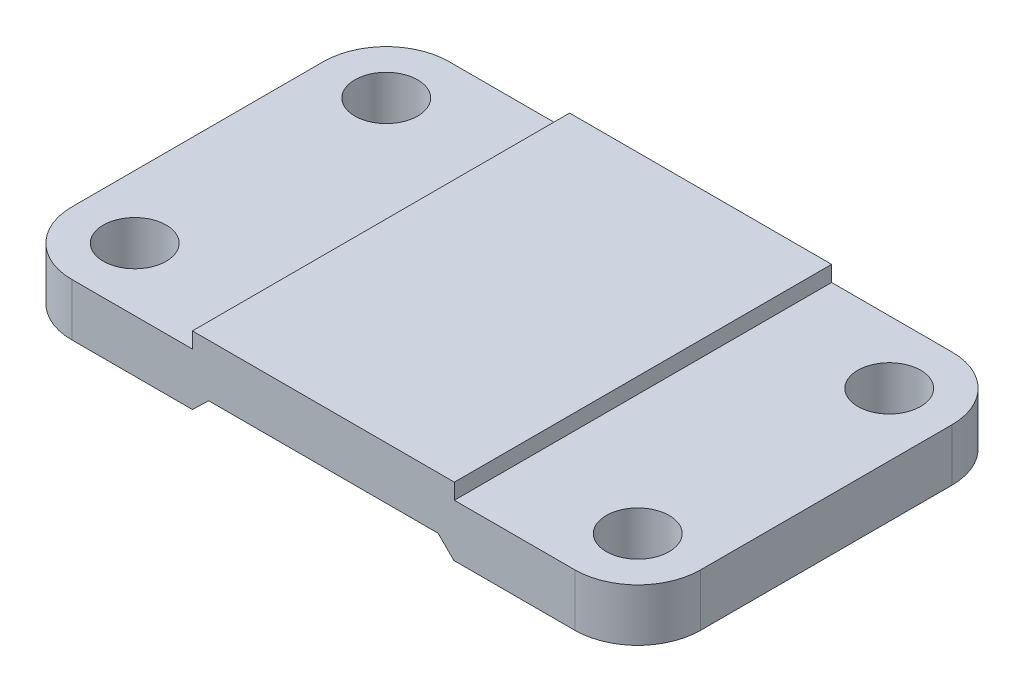
ISO-10303-21;
HEADER;
FILE_DESCRIPTION(('STEP AP214'),'2;1');
FILE_NAME('part.step','',(''),(''),'','','');
FILE_SCHEMA(('AUTOMOTIVE_DESIGN { 1 0 10303 214 1 1 1 1 }'));
ENDSEC;
DATA;
#1=APPLICATION_CONTEXT('core data for automotive mechanical design processes');
#2=APPLICATION_PROTOCOL_DEFINITION('international standard','automotive_design',2000,#1);
#3=PRODUCT_CONTEXT('',#1,'mechanical');
#4=PRODUCT('Part','Part','',(#3));
#5=PRODUCT_RELATED_PRODUCT_CATEGORY('part','',(#4));
#6=PRODUCT_DEFINITION_FORMATION('','',#4);
#7=PRODUCT_DEFINITION_CONTEXT('part definition',#1,'design');
#8=PRODUCT_DEFINITION('design','',#6,#7);
#9=PRODUCT_DEFINITION_SHAPE('','',#8);
#10=(LENGTH_UNIT() NAMED_UNIT(*) SI_UNIT(.MILLI.,.METRE.));
#11=(NAMED_UNIT(*) PLANE_ANGLE_UNIT() SI_UNIT($,.RADIAN.));
#12=(NAMED_UNIT(*) SI_UNIT($,.STERADIAN.) SOLID_ANGLE_UNIT());
#13=UNCERTAINTY_MEASURE_WITH_UNIT(LENGTH_MEASURE(1.E-05),#10,'distance_accuracy_value','');
#14=(GEOMETRIC_REPRESENTATION_CONTEXT(3) GLOBAL_UNCERTAINTY_ASSIGNED_CONTEXT((#13)) GLOBAL_UNIT_ASSIGNED_CONTEXT((#10,
#11,#12)) REPRESENTATION_CONTEXT('',''));
#15=CARTESIAN_POINT('',(0.,0.,0.));
#16=DIRECTION('',(0.,0.,1.));
#17=DIRECTION('',(1.,0.,0.));
#18=AXIS2_PLACEMENT_3D('',#15,#16,#17);
#19=CARTESIAN_POINT('',(-48.,0.,-24.));
#20=DIRECTION('',(0.,1.,0.));
#21=DIRECTION('',(0.,0.,1.));
#22=AXIS2_PLACEMENT_3D('',#19,#20,#21);
#23=PLANE('',#22);
#24=CARTESIAN_POINT('',(48.,0.,24.));
#25=DIRECTION('',(0.,1.,0.));
#26=DIRECTION('',(0.,0.,1.));
#27=AXIS2_PLACEMENT_3D('',#24,#25,#26);
#28=CIRCLE('',#27,6.);
#29=CARTESIAN_POINT('',(48.,0.,30.));
#30=VERTEX_POINT('',#29);
#31=EDGE_CURVE('E210',#30,#30,#28,.T.);
#32=ORIENTED_EDGE('',*,*,#31,.T.);
#33=EDGE_LOOP('',(#32));
#34=FACE_BOUND('',#33,.T.);
#35=CARTESIAN_POINT('',(48.,0.,-24.));
#36=DIRECTION('',(0.,1.,0.));
#37=DIRECTION('',(0.,0.,-1.));
#38=AXIS2_PLACEMENT_3D('',#35,#36,#37);
#39=CIRCLE('',#38,6.);
#40=CARTESIAN_POINT('',(48.,0.,-30.));
#41=VERTEX_POINT('',#40);
#42=EDGE_CURVE('E216',#41,#41,#39,.T.);
#43=ORIENTED_EDGE('',*,*,#42,.T.);
#44=EDGE_LOOP('',(#43));
#45=FACE_BOUND('',#44,.T.);
#46=DIRECTION('',(1.,0.,0.));
#47=VECTOR('',#46,1.);
#48=CARTESIAN_POINT('',(-48.,0.,36.));
#49=LINE('',#48,#47);
#50=CARTESIAN_POINT('',(24.9,0.,36.));
#51=VERTEX_POINT('',#50);
#52=CARTESIAN_POINT('',(48.,0.,36.));
#53=VERTEX_POINT('',#52);
#54=EDGE_CURVE('E256',#51,#53,#49,.T.);
#55=ORIENTED_EDGE('',*,*,#54,.F.);
#56=DIRECTION('',(0.,0.,1.));
#57=VECTOR('',#56,1.);
#58=CARTESIAN_POINT('',(24.9,0.,-464.));
#59=LINE('',#58,#57);
#60=CARTESIAN_POINT('',(24.9,0.,-36.));
#61=VERTEX_POINT('',#60);
#62=EDGE_CURVE('E167',#61,#51,#59,.T.);
#63=ORIENTED_EDGE('',*,*,#62,.F.);
#64=DIRECTION('',(-1.,0.,0.));
#65=VECTOR('',#64,1.);
#66=CARTESIAN_POINT('',(0.,0.,-36.));
#67=LINE('',#66,#65);
#68=CARTESIAN_POINT('',(48.,0.,-36.));
#69=VERTEX_POINT('',#68);
#70=EDGE_CURVE('E266',#69,#61,#67,.T.);
#71=ORIENTED_EDGE('',*,*,#70,.F.);
#72=CARTESIAN_POINT('',(48.,0.,-24.));
#73=DIRECTION('',(0.,1.,0.));
#74=DIRECTION('',(0.,0.,-1.));
#75=AXIS2_PLACEMENT_3D('',#72,#73,#74);
#76=CIRCLE('',#75,12.);
#77=CARTESIAN_POINT('',(60.,0.,-24.));
#78=VERTEX_POINT('',#77);
#79=EDGE_CURVE('E263',#78,#69,#76,.T.);
#80=ORIENTED_EDGE('',*,*,#79,.F.);
#81=DIRECTION('',(0.,0.,-1.));
#82=VECTOR('',#81,1.);
#83=CARTESIAN_POINT('',(60.,0.,24.));
#84=LINE('',#83,#82);
#85=CARTESIAN_POINT('',(60.,0.,24.));
#86=VERTEX_POINT('',#85);
#87=EDGE_CURVE('E261',#86,#78,#84,.T.);
#88=ORIENTED_EDGE('',*,*,#87,.F.);
#89=CARTESIAN_POINT('',(48.,0.,24.));
#90=DIRECTION('',(0.,1.,0.));
#91=DIRECTION('',(0.,0.,1.));
#92=AXIS2_PLACEMENT_3D('',#89,#90,#91);
#93=CIRCLE('',#92,12.);
#94=EDGE_CURVE('E259',#53,#86,#93,.T.);
#95=ORIENTED_EDGE('',*,*,#94,.F.);
#96=EDGE_LOOP('',(#55,#63,#71,#80,#88,#95));
#97=FACE_BOUND('',#96,.T.);
#98=ADVANCED_FACE('F41',(#34,#45,#97),#23,.F.);
#99=CARTESIAN_POINT('',(-48.,10.,-24.));
#100=DIRECTION('',(0.,1.,0.));
#101=DIRECTION('',(0.,0.,1.));
#102=AXIS2_PLACEMENT_3D('',#99,#100,#101);
#103=PLANE('',#102);
#104=CARTESIAN_POINT('',(-48.,10.,24.));
#105=DIRECTION('',(0.,1.,0.));
#106=DIRECTION('',(0.,0.,-1.));
#107=AXIS2_PLACEMENT_3D('',#104,#105,#106);
#108=CIRCLE('',#107,6.);
#109=CARTESIAN_POINT('',(-48.,10.,18.));
#110=VERTEX_POINT('',#109);
#111=EDGE_CURVE('E207',#110,#110,#108,.T.);
#112=ORIENTED_EDGE('',*,*,#111,.F.);
#113=EDGE_LOOP('',(#112));
#114=FACE_BOUND('',#113,.T.);
#115=CARTESIAN_POINT('',(-48.,10.,-24.));
#116=DIRECTION('',(0.,1.,0.));
#117=DIRECTION('',(0.,0.,1.));
#118=AXIS2_PLACEMENT_3D('',#115,#116,#117);
#119=CIRCLE('',#118,6.);
#120=CARTESIAN_POINT('',(-48.,10.,-18.));
#121=VERTEX_POINT('',#120);
#122=EDGE_CURVE('E225',#121,#121,#119,.T.);
#123=ORIENTED_EDGE('',*,*,#122,.F.);
#124=EDGE_LOOP('',(#123));
#125=FACE_BOUND('',#124,.T.);
#126=DIRECTION('',(1.,0.,0.));
#127=VECTOR('',#126,1.);
#128=CARTESIAN_POINT('',(-48.,10.,36.));
#129=LINE('',#128,#127);
#130=CARTESIAN_POINT('',(-48.,10.,36.));
#131=VERTEX_POINT('',#130);
#132=CARTESIAN_POINT('',(-25.,10.,36.));
#133=VERTEX_POINT('',#132);
#134=EDGE_CURVE('E241',#131,#133,#129,.T.);
#135=ORIENTED_EDGE('',*,*,#134,.T.);
#136=DIRECTION('',(0.,0.,-1.));
#137=VECTOR('',#136,1.);
#138=CARTESIAN_POINT('',(-25.,10.,0.));
#139=LINE('',#138,#137);
#140=CARTESIAN_POINT('',(-25.,10.,-36.));
#141=VERTEX_POINT('',#140);
#142=EDGE_CURVE('E185',#133,#141,#139,.T.);
#143=ORIENTED_EDGE('',*,*,#142,.T.);
#144=DIRECTION('',(-1.,0.,0.));
#145=VECTOR('',#144,1.);
#146=CARTESIAN_POINT('',(0.,10.,-36.));
#147=LINE('',#146,#145);
#148=CARTESIAN_POINT('',(-48.,10.,-36.));
#149=VERTEX_POINT('',#148);
#150=EDGE_CURVE('E234',#141,#149,#147,.T.);
#151=ORIENTED_EDGE('',*,*,#150,.T.);
#152=CARTESIAN_POINT('',(-48.,10.,-24.));
#153=DIRECTION('',(0.,1.,0.));
#154=DIRECTION('',(0.,0.,1.));
#155=AXIS2_PLACEMENT_3D('',#152,#153,#154);
#156=CIRCLE('',#155,12.);
#157=CARTESIAN_POINT('',(-60.,10.,-24.));
#158=VERTEX_POINT('',#157);
#159=EDGE_CURVE('E233',#149,#158,#156,.T.);
#160=ORIENTED_EDGE('',*,*,#159,.T.);
#161=DIRECTION('',(0.,0.,1.));
#162=VECTOR('',#161,1.);
#163=CARTESIAN_POINT('',(-60.,10.,-24.));
#164=LINE('',#163,#162);
#165=CARTESIAN_POINT('',(-60.,10.,24.));
#166=VERTEX_POINT('',#165);
#167=EDGE_CURVE('E236',#158,#166,#164,.T.);
#168=ORIENTED_EDGE('',*,*,#167,.T.);
#169=CARTESIAN_POINT('',(-48.,10.,24.));
#170=DIRECTION('',(0.,1.,0.));
#171=DIRECTION('',(0.,0.,-1.));
#172=AXIS2_PLACEMENT_3D('',#169,#170,#171);
#173=CIRCLE('',#172,12.);
#174=EDGE_CURVE('E238',#166,#131,#173,.T.);
#175=ORIENTED_EDGE('',*,*,#174,.T.);
#176=EDGE_LOOP('',(#135,#143,#151,#160,#168,#175));
#177=FACE_BOUND('',#176,.T.);
#178=ADVANCED_FACE('F344',(#114,#125,#177),#103,.T.);
#179=DIRECTION('',(0.,0.,-1.));
#180=VECTOR('',#179,1.);
#181=CARTESIAN_POINT('',(25.,10.,0.));
#182=LINE('',#181,#180);
#183=CARTESIAN_POINT('',(25.,10.,36.));
#184=VERTEX_POINT('',#183);
#185=CARTESIAN_POINT('',(25.,10.,-36.));
#186=VERTEX_POINT('',#185);
#187=EDGE_CURVE('E64',#184,#186,#182,.T.);
#188=ORIENTED_EDGE('',*,*,#187,.F.);
#189=CARTESIAN_POINT('',(48.,10.,36.));
#190=VERTEX_POINT('',#189);
#191=EDGE_CURVE('E240',#184,#190,#129,.T.);
#192=ORIENTED_EDGE('',*,*,#191,.T.);
#193=CARTESIAN_POINT('',(48.,10.,24.));
#194=DIRECTION('',(0.,1.,0.));
#195=DIRECTION('',(0.,0.,1.));
#196=AXIS2_PLACEMENT_3D('',#193,#194,#195);
#197=CIRCLE('',#196,12.);
#198=CARTESIAN_POINT('',(60.,10.,24.));
#199=VERTEX_POINT('',#198);
#200=EDGE_CURVE('E243',#190,#199,#197,.T.);
#201=ORIENTED_EDGE('',*,*,#200,.T.);
#202=DIRECTION('',(0.,0.,-1.));
#203=VECTOR('',#202,1.);
#204=CARTESIAN_POINT('',(60.,10.,24.));
#205=LINE('',#204,#203);
#206=CARTESIAN_POINT('',(60.,10.,-24.));
#207=VERTEX_POINT('',#206);
#208=EDGE_CURVE('E245',#199,#207,#205,.T.);
#209=ORIENTED_EDGE('',*,*,#208,.T.);
#210=CARTESIAN_POINT('',(48.,10.,-24.));
#211=DIRECTION('',(0.,1.,0.));
#212=DIRECTION('',(0.,0.,-1.));
#213=AXIS2_PLACEMENT_3D('',#210,#211,#212);
#214=CIRCLE('',#213,12.);
#215=CARTESIAN_POINT('',(48.,10.,-36.));
#216=VERTEX_POINT('',#215);
#217=EDGE_CURVE('E247',#207,#216,#214,.T.);
#218=ORIENTED_EDGE('',*,*,#217,.T.);
#219=EDGE_CURVE('E231',#216,#186,#147,.T.);
#220=ORIENTED_EDGE('',*,*,#219,.T.);
#221=EDGE_LOOP('',(#188,#192,#201,#209,#218,#220));
#222=FACE_BOUND('',#221,.T.);
#223=CARTESIAN_POINT('',(48.,10.,24.));
#224=DIRECTION('',(0.,1.,0.));
#225=DIRECTION('',(0.,0.,1.));
#226=AXIS2_PLACEMENT_3D('',#223,#224,#225);
#227=CIRCLE('',#226,6.);
#228=CARTESIAN_POINT('',(48.,10.,30.));
#229=VERTEX_POINT('',#228);
#230=EDGE_CURVE('E213',#229,#229,#227,.T.);
#231=ORIENTED_EDGE('',*,*,#230,.F.);
#232=EDGE_LOOP('',(#231));
#233=FACE_BOUND('',#232,.T.);
#234=CARTESIAN_POINT('',(48.,10.,-24.));
#235=DIRECTION('',(0.,1.,0.));
#236=DIRECTION('',(0.,0.,-1.));
#237=AXIS2_PLACEMENT_3D('',#234,#235,#236);
#238=CIRCLE('',#237,6.);
#239=CARTESIAN_POINT('',(48.,10.,-30.));
#240=VERTEX_POINT('',#239);
#241=EDGE_CURVE('E219',#240,#240,#238,.T.);
#242=ORIENTED_EDGE('',*,*,#241,.F.);
#243=EDGE_LOOP('',(#242));
#244=FACE_BOUND('',#243,.T.);
#245=ADVANCED_FACE('F325',(#222,#233,#244),#103,.T.);
#246=CARTESIAN_POINT('',(-25.,0.,-36.));
#247=VERTEX_POINT('',#246);
#248=CARTESIAN_POINT('',(-48.,0.,-36.));
#249=VERTEX_POINT('',#248);
#250=EDGE_CURVE('E265',#247,#249,#67,.T.);
#251=ORIENTED_EDGE('',*,*,#250,.F.);
#252=DIRECTION('',(0.,0.,1.));
#253=VECTOR('',#252,1.);
#254=CARTESIAN_POINT('',(-25.,0.,-464.));
#255=LINE('',#254,#253);
#256=CARTESIAN_POINT('',(-25.,0.,36.));
#257=VERTEX_POINT('',#256);
#258=EDGE_CURVE('E177',#247,#257,#255,.T.);
#259=ORIENTED_EDGE('',*,*,#258,.T.);
#260=CARTESIAN_POINT('',(-48.,0.,36.));
#261=VERTEX_POINT('',#260);
#262=EDGE_CURVE('E257',#261,#257,#49,.T.);
#263=ORIENTED_EDGE('',*,*,#262,.F.);
#264=CARTESIAN_POINT('',(-48.,0.,24.));
#265=DIRECTION('',(0.,1.,0.));
#266=DIRECTION('',(0.,0.,-1.));
#267=AXIS2_PLACEMENT_3D('',#264,#265,#266);
#268=CIRCLE('',#267,12.);
#269=CARTESIAN_POINT('',(-60.,0.,24.));
#270=VERTEX_POINT('',#269);
#271=EDGE_CURVE('E254',#270,#261,#268,.T.);
#272=ORIENTED_EDGE('',*,*,#271,.F.);
#273=DIRECTION('',(0.,0.,1.));
#274=VECTOR('',#273,1.);
#275=CARTESIAN_POINT('',(-60.,0.,-24.));
#276=LINE('',#275,#274);
#277=CARTESIAN_POINT('',(-60.,0.,-24.));
#278=VERTEX_POINT('',#277);
#279=EDGE_CURVE('E252',#278,#270,#276,.T.);
#280=ORIENTED_EDGE('',*,*,#279,.F.);
#281=CARTESIAN_POINT('',(-48.,0.,-24.));
#282=DIRECTION('',(0.,1.,0.));
#283=DIRECTION('',(0.,0.,1.));
#284=AXIS2_PLACEMENT_3D('',#281,#282,#283);
#285=CIRCLE('',#284,12.);
#286=EDGE_CURVE('E228',#249,#278,#285,.T.);
#287=ORIENTED_EDGE('',*,*,#286,.F.);
#288=EDGE_LOOP('',(#251,#259,#263,#272,#280,#287));
#289=FACE_BOUND('',#288,.T.);
#290=CARTESIAN_POINT('',(-48.,0.,-24.));
#291=DIRECTION('',(0.,1.,0.));
#292=DIRECTION('',(0.,0.,1.));
#293=AXIS2_PLACEMENT_3D('',#290,#291,#292);
#294=CIRCLE('',#293,6.);
#295=CARTESIAN_POINT('',(-48.,0.,-18.));
#296=VERTEX_POINT('',#295);
#297=EDGE_CURVE('E222',#296,#296,#294,.T.);
#298=ORIENTED_EDGE('',*,*,#297,.T.);
#299=EDGE_LOOP('',(#298));
#300=FACE_BOUND('',#299,.T.);
#301=CARTESIAN_POINT('',(-48.,0.,24.));
#302=DIRECTION('',(0.,1.,0.));
#303=DIRECTION('',(0.,0.,-1.));
#304=AXIS2_PLACEMENT_3D('',#301,#302,#303);
#305=CIRCLE('',#304,6.);
#306=CARTESIAN_POINT('',(-48.,0.,18.));
#307=VERTEX_POINT('',#306);
#308=EDGE_CURVE('E206',#307,#307,#305,.T.);
#309=ORIENTED_EDGE('',*,*,#308,.T.);
#310=EDGE_LOOP('',(#309));
#311=FACE_BOUND('',#310,.T.);
#312=ADVANCED_FACE('F300',(#289,#300,#311),#23,.F.);
#313=CARTESIAN_POINT('',(-48.,10.,-24.));
#314=DIRECTION('',(0.,-1.,0.));
#315=DIRECTION('',(0.,0.,-1.));
#316=AXIS2_PLACEMENT_3D('',#313,#314,#315);
#317=CYLINDRICAL_SURFACE('',#316,12.);
#318=ORIENTED_EDGE('',*,*,#286,.T.);
#319=DIRECTION('',(0.,-1.,0.));
#320=VECTOR('',#319,1.);
#321=CARTESIAN_POINT('',(-60.,10.,-24.));
#322=LINE('',#321,#320);
#323=EDGE_CURVE('E286',#158,#278,#322,.T.);
#324=ORIENTED_EDGE('',*,*,#323,.F.);
#325=ORIENTED_EDGE('',*,*,#159,.F.);
#326=DIRECTION('',(0.,-1.,0.));
#327=VECTOR('',#326,1.);
#328=CARTESIAN_POINT('',(-48.,10.,-36.));
#329=LINE('',#328,#327);
#330=EDGE_CURVE('E289',#149,#249,#329,.T.);
#331=ORIENTED_EDGE('',*,*,#330,.T.);
#332=EDGE_LOOP('',(#318,#324,#325,#331));
#333=FACE_BOUND('',#332,.T.);
#334=ADVANCED_FACE('F43',(#333),#317,.T.);
#335=CARTESIAN_POINT('',(-60.,10.,-24.));
#336=DIRECTION('',(1.,0.,0.));
#337=DIRECTION('',(0.,0.,-1.));
#338=AXIS2_PLACEMENT_3D('',#335,#336,#337);
#339=PLANE('',#338);
#340=ORIENTED_EDGE('',*,*,#279,.T.);
#341=DIRECTION('',(0.,-1.,0.));
#342=VECTOR('',#341,1.);
#343=CARTESIAN_POINT('',(-60.,10.,24.));
#344=LINE('',#343,#342);
#345=EDGE_CURVE('E283',#166,#270,#344,.T.);
#346=ORIENTED_EDGE('',*,*,#345,.F.);
#347=ORIENTED_EDGE('',*,*,#167,.F.);
#348=ORIENTED_EDGE('',*,*,#323,.T.);
#349=EDGE_LOOP('',(#340,#346,#347,#348));
#350=FACE_BOUND('',#349,.T.);
#351=ADVANCED_FACE('F359',(#350),#339,.F.);
#352=CARTESIAN_POINT('',(-48.,10.,24.));
#353=DIRECTION('',(0.,-1.,0.));
#354=DIRECTION('',(0.,0.,-1.));
#355=AXIS2_PLACEMENT_3D('',#352,#353,#354);
#356=CYLINDRICAL_SURFACE('',#355,12.);
#357=ORIENTED_EDGE('',*,*,#271,.T.);
#358=DIRECTION('',(0.,-1.,0.));
#359=VECTOR('',#358,1.);
#360=CARTESIAN_POINT('',(-48.,10.,36.));
#361=LINE('',#360,#359);
#362=EDGE_CURVE('E280',#131,#261,#361,.T.);
#363=ORIENTED_EDGE('',*,*,#362,.F.);
#364=ORIENTED_EDGE('',*,*,#174,.F.);
#365=ORIENTED_EDGE('',*,*,#345,.T.);
#366=EDGE_LOOP('',(#357,#363,#364,#365));
#367=FACE_BOUND('',#366,.T.);
#368=ADVANCED_FACE('F501',(#367),#356,.T.);
#369=CARTESIAN_POINT('',(-48.,10.,36.));
#370=DIRECTION('',(0.,0.,-1.));
#371=DIRECTION('',(-1.,0.,0.));
#372=AXIS2_PLACEMENT_3D('',#369,#370,#371);
#373=PLANE('',#372);
#374=DIRECTION('',(-1.,0.,0.));
#375=VECTOR('',#374,1.);
#376=CARTESIAN_POINT('',(-21.8986410140214,3.,36.));
#377=LINE('',#376,#375);
#378=CARTESIAN_POINT('',(21.9,3.,36.));
#379=VERTEX_POINT('',#378);
#380=CARTESIAN_POINT('',(-21.8986410140214,3.,36.));
#381=VERTEX_POINT('',#380);
#382=EDGE_CURVE('E156',#379,#381,#377,.T.);
#383=ORIENTED_EDGE('',*,*,#382,.F.);
#384=DIRECTION('',(-0.707106781186551,0.707106781186544,0.));
#385=VECTOR('',#384,1.);
#386=CARTESIAN_POINT('',(21.9,3.,36.));
#387=LINE('',#386,#385);
#388=EDGE_CURVE('E164',#51,#379,#387,.T.);
#389=ORIENTED_EDGE('',*,*,#388,.F.);
#390=ORIENTED_EDGE('',*,*,#54,.T.);
#391=DIRECTION('',(0.,-1.,0.));
#392=VECTOR('',#391,1.);
#393=CARTESIAN_POINT('',(48.,10.,36.));
#394=LINE('',#393,#392);
#395=EDGE_CURVE('E277',#190,#53,#394,.T.);
#396=ORIENTED_EDGE('',*,*,#395,.F.);
#397=ORIENTED_EDGE('',*,*,#191,.F.);
#398=DIRECTION('',(0.,-1.,0.));
#399=VECTOR('',#398,1.);
#400=CARTESIAN_POINT('',(25.,13.,36.));
#401=LINE('',#400,#399);
#402=CARTESIAN_POINT('',(25.,13.,36.));
#403=VERTEX_POINT('',#402);
#404=EDGE_CURVE('E203',#403,#184,#401,.T.);
#405=ORIENTED_EDGE('',*,*,#404,.F.);
#406=DIRECTION('',(1.,0.,0.));
#407=VECTOR('',#406,1.);
#408=CARTESIAN_POINT('',(0.,13.,36.));
#409=LINE('',#408,#407);
#410=CARTESIAN_POINT('',(-25.,13.,36.));
#411=VERTEX_POINT('',#410);
#412=EDGE_CURVE('E181',#411,#403,#409,.T.);
#413=ORIENTED_EDGE('',*,*,#412,.F.);
#414=DIRECTION('',(0.,-1.,0.));
#415=VECTOR('',#414,1.);
#416=CARTESIAN_POINT('',(-25.,13.,36.));
#417=LINE('',#416,#415);
#418=EDGE_CURVE('E192',#411,#133,#417,.T.);
#419=ORIENTED_EDGE('',*,*,#418,.T.);
#420=ORIENTED_EDGE('',*,*,#134,.F.);
#421=ORIENTED_EDGE('',*,*,#362,.T.);
#422=ORIENTED_EDGE('',*,*,#262,.T.);
#423=DIRECTION('',(-0.718754438456388,-0.695264019778992,0.));
#424=VECTOR('',#423,1.);
#425=CARTESIAN_POINT('',(-25.,0.,36.));
#426=LINE('',#425,#424);
#427=EDGE_CURVE('E161',#381,#257,#426,.T.);
#428=ORIENTED_EDGE('',*,*,#427,.F.);
#429=EDGE_LOOP('',(#383,#389,#390,#396,#397,#405,#413,#419,#420,#421,#422,#428));
#430=FACE_BOUND('',#429,.T.);
#431=ADVANCED_FACE('F171',(#430),#373,.F.);
#432=CARTESIAN_POINT('',(48.,10.,24.));
#433=DIRECTION('',(0.,-1.,0.));
#434=DIRECTION('',(0.,0.,-1.));
#435=AXIS2_PLACEMENT_3D('',#432,#433,#434);
#436=CYLINDRICAL_SURFACE('',#435,12.);
#437=ORIENTED_EDGE('',*,*,#94,.T.);
#438=DIRECTION('',(0.,-1.,0.));
#439=VECTOR('',#438,1.);
#440=CARTESIAN_POINT('',(60.,10.,24.));
#441=LINE('',#440,#439);
#442=EDGE_CURVE('E274',#199,#86,#441,.T.);
#443=ORIENTED_EDGE('',*,*,#442,.F.);
#444=ORIENTED_EDGE('',*,*,#200,.F.);
#445=ORIENTED_EDGE('',*,*,#395,.T.);
#446=EDGE_LOOP('',(#437,#443,#444,#445));
#447=FACE_BOUND('',#446,.T.);
#448=ADVANCED_FACE('F331',(#447),#436,.T.);
#449=CARTESIAN_POINT('',(60.,10.,24.));
#450=DIRECTION('',(-1.,0.,0.));
#451=DIRECTION('',(0.,0.,1.));
#452=AXIS2_PLACEMENT_3D('',#449,#450,#451);
#453=PLANE('',#452);
#454=ORIENTED_EDGE('',*,*,#87,.T.);
#455=DIRECTION('',(0.,-1.,0.));
#456=VECTOR('',#455,1.);
#457=CARTESIAN_POINT('',(60.,10.,-24.));
#458=LINE('',#457,#456);
#459=EDGE_CURVE('E271',#207,#78,#458,.T.);
#460=ORIENTED_EDGE('',*,*,#459,.F.);
#461=ORIENTED_EDGE('',*,*,#208,.F.);
#462=ORIENTED_EDGE('',*,*,#442,.T.);
#463=EDGE_LOOP('',(#454,#460,#461,#462));
#464=FACE_BOUND('',#463,.T.);
#465=ADVANCED_FACE('F335',(#464),#453,.F.);
#466=CARTESIAN_POINT('',(48.,10.,-24.));
#467=DIRECTION('',(0.,-1.,0.));
#468=DIRECTION('',(0.,0.,-1.));
#469=AXIS2_PLACEMENT_3D('',#466,#467,#468);
#470=CYLINDRICAL_SURFACE('',#469,12.);
#471=ORIENTED_EDGE('',*,*,#79,.T.);
#472=DIRECTION('',(0.,-1.,0.));
#473=VECTOR('',#472,1.);
#474=CARTESIAN_POINT('',(48.,10.,-36.));
#475=LINE('',#474,#473);
#476=EDGE_CURVE('E250',#216,#69,#475,.T.);
#477=ORIENTED_EDGE('',*,*,#476,.F.);
#478=ORIENTED_EDGE('',*,*,#217,.F.);
#479=ORIENTED_EDGE('',*,*,#459,.T.);
#480=EDGE_LOOP('',(#471,#477,#478,#479));
#481=FACE_BOUND('',#480,.T.);
#482=ADVANCED_FACE('F340',(#481),#470,.T.);
#483=CARTESIAN_POINT('',(0.,10.,-36.));
#484=DIRECTION('',(0.,0.,1.));
#485=DIRECTION('',(1.,0.,0.));
#486=AXIS2_PLACEMENT_3D('',#483,#484,#485);
#487=PLANE('',#486);
#488=ORIENTED_EDGE('',*,*,#70,.T.);
#489=DIRECTION('',(-0.707106781186551,0.707106781186544,0.));
#490=VECTOR('',#489,1.);
#491=CARTESIAN_POINT('',(7.44999999999988,17.45,-36.));
#492=LINE('',#491,#490);
#493=CARTESIAN_POINT('',(21.9,3.,-36.));
#494=VERTEX_POINT('',#493);
#495=EDGE_CURVE('E11',#61,#494,#492,.T.);
#496=ORIENTED_EDGE('',*,*,#495,.T.);
#497=DIRECTION('',(-1.,0.,0.));
#498=VECTOR('',#497,1.);
#499=CARTESIAN_POINT('',(0.,3.,-36.));
#500=LINE('',#499,#498);
#501=CARTESIAN_POINT('',(-21.8986410140214,3.,-36.));
#502=VERTEX_POINT('',#501);
#503=EDGE_CURVE('E159',#494,#502,#500,.T.);
#504=ORIENTED_EDGE('',*,*,#503,.T.);
#505=DIRECTION('',(-0.718754438456388,-0.695264019778992,0.));
#506=VECTOR('',#505,1.);
#507=CARTESIAN_POINT('',(-7.08756042882927,17.3270230748719,-36.));
#508=LINE('',#507,#506);
#509=EDGE_CURVE('E49',#502,#247,#508,.T.);
#510=ORIENTED_EDGE('',*,*,#509,.T.);
#511=ORIENTED_EDGE('',*,*,#250,.T.);
#512=ORIENTED_EDGE('',*,*,#330,.F.);
#513=ORIENTED_EDGE('',*,*,#150,.F.);
#514=DIRECTION('',(0.,-1.,0.));
#515=VECTOR('',#514,1.);
#516=CARTESIAN_POINT('',(-25.,13.,-36.));
#517=LINE('',#516,#515);
#518=CARTESIAN_POINT('',(-25.,13.,-36.));
#519=VERTEX_POINT('',#518);
#520=EDGE_CURVE('E197',#519,#141,#517,.T.);
#521=ORIENTED_EDGE('',*,*,#520,.F.);
#522=DIRECTION('',(-1.,0.,0.));
#523=VECTOR('',#522,1.);
#524=CARTESIAN_POINT('',(0.,13.,-36.));
#525=LINE('',#524,#523);
#526=CARTESIAN_POINT('',(25.,13.,-36.));
#527=VERTEX_POINT('',#526);
#528=EDGE_CURVE('E187',#527,#519,#525,.T.);
#529=ORIENTED_EDGE('',*,*,#528,.F.);
#530=DIRECTION('',(0.,-1.,0.));
#531=VECTOR('',#530,1.);
#532=CARTESIAN_POINT('',(25.,13.,-36.));
#533=LINE('',#532,#531);
#534=EDGE_CURVE('E200',#527,#186,#533,.T.);
#535=ORIENTED_EDGE('',*,*,#534,.T.);
#536=ORIENTED_EDGE('',*,*,#219,.F.);
#537=ORIENTED_EDGE('',*,*,#476,.T.);
#538=EDGE_LOOP('',(#488,#496,#504,#510,#511,#512,#513,#521,#529,#535,#536,#537));
#539=FACE_BOUND('',#538,.T.);
#540=ADVANCED_FACE('F295',(#539),#487,.F.);
#541=CARTESIAN_POINT('',(-48.,10.,-24.));
#542=DIRECTION('',(0.,-1.,0.));
#543=DIRECTION('',(0.,0.,-1.));
#544=AXIS2_PLACEMENT_3D('',#541,#542,#543);
#545=CYLINDRICAL_SURFACE('',#544,6.);
#546=ORIENTED_EDGE('',*,*,#122,.T.);
#547=EDGE_LOOP('',(#546));
#548=FACE_BOUND('',#547,.T.);
#549=ORIENTED_EDGE('',*,*,#297,.F.);
#550=EDGE_LOOP('',(#549));
#551=FACE_BOUND('',#550,.T.);
#552=ADVANCED_FACE('F363',(#548,#551),#545,.F.);
#553=CARTESIAN_POINT('',(48.,10.,-24.));
#554=DIRECTION('',(0.,-1.,0.));
#555=DIRECTION('',(0.,0.,-1.));
#556=AXIS2_PLACEMENT_3D('',#553,#554,#555);
#557=CYLINDRICAL_SURFACE('',#556,6.);
#558=ORIENTED_EDGE('',*,*,#241,.T.);
#559=EDGE_LOOP('',(#558));
#560=FACE_BOUND('',#559,.T.);
#561=ORIENTED_EDGE('',*,*,#42,.F.);
#562=EDGE_LOOP('',(#561));
#563=FACE_BOUND('',#562,.T.);
#564=ADVANCED_FACE('F366',(#560,#563),#557,.F.);
#565=CARTESIAN_POINT('',(48.,10.,24.));
#566=DIRECTION('',(0.,-1.,0.));
#567=DIRECTION('',(0.,0.,-1.));
#568=AXIS2_PLACEMENT_3D('',#565,#566,#567);
#569=CYLINDRICAL_SURFACE('',#568,6.);
#570=ORIENTED_EDGE('',*,*,#230,.T.);
#571=EDGE_LOOP('',(#570));
#572=FACE_BOUND('',#571,.T.);
#573=ORIENTED_EDGE('',*,*,#31,.F.);
#574=EDGE_LOOP('',(#573));
#575=FACE_BOUND('',#574,.T.);
#576=ADVANCED_FACE('F370',(#572,#575),#569,.F.);
#577=CARTESIAN_POINT('',(-48.,10.,24.));
#578=DIRECTION('',(0.,-1.,0.));
#579=DIRECTION('',(0.,0.,-1.));
#580=AXIS2_PLACEMENT_3D('',#577,#578,#579);
#581=CYLINDRICAL_SURFACE('',#580,6.);
#582=ORIENTED_EDGE('',*,*,#111,.T.);
#583=EDGE_LOOP('',(#582));
#584=FACE_BOUND('',#583,.T.);
#585=ORIENTED_EDGE('',*,*,#308,.F.);
#586=EDGE_LOOP('',(#585));
#587=FACE_BOUND('',#586,.T.);
#588=ADVANCED_FACE('F374',(#584,#587),#581,.F.);
#589=CARTESIAN_POINT('',(25.,13.,0.));
#590=DIRECTION('',(-1.,0.,0.));
#591=DIRECTION('',(0.,0.,1.));
#592=AXIS2_PLACEMENT_3D('',#589,#590,#591);
#593=PLANE('',#592);
#594=ORIENTED_EDGE('',*,*,#187,.T.);
#595=ORIENTED_EDGE('',*,*,#534,.F.);
#596=DIRECTION('',(0.,0.,-1.));
#597=VECTOR('',#596,1.);
#598=CARTESIAN_POINT('',(25.,13.,0.));
#599=LINE('',#598,#597);
#600=EDGE_CURVE('E184',#403,#527,#599,.T.);
#601=ORIENTED_EDGE('',*,*,#600,.F.);
#602=ORIENTED_EDGE('',*,*,#404,.T.);
#603=EDGE_LOOP('',(#594,#595,#601,#602));
#604=FACE_BOUND('',#603,.T.);
#605=ADVANCED_FACE('F322',(#604),#593,.F.);
#606=CARTESIAN_POINT('',(-25.,13.,0.));
#607=DIRECTION('',(-1.,0.,0.));
#608=DIRECTION('',(0.,0.,1.));
#609=AXIS2_PLACEMENT_3D('',#606,#607,#608);
#610=PLANE('',#609);
#611=ORIENTED_EDGE('',*,*,#142,.F.);
#612=ORIENTED_EDGE('',*,*,#418,.F.);
#613=DIRECTION('',(0.,0.,-1.));
#614=VECTOR('',#613,1.);
#615=CARTESIAN_POINT('',(-25.,13.,0.));
#616=LINE('',#615,#614);
#617=EDGE_CURVE('E189',#411,#519,#616,.T.);
#618=ORIENTED_EDGE('',*,*,#617,.T.);
#619=ORIENTED_EDGE('',*,*,#520,.T.);
#620=EDGE_LOOP('',(#611,#612,#618,#619));
#621=FACE_BOUND('',#620,.T.);
#622=ADVANCED_FACE('F314',(#621),#610,.T.);
#623=CARTESIAN_POINT('',(0.,13.,0.));
#624=DIRECTION('',(0.,1.,0.));
#625=DIRECTION('',(0.,0.,1.));
#626=AXIS2_PLACEMENT_3D('',#623,#624,#625);
#627=PLANE('',#626);
#628=ORIENTED_EDGE('',*,*,#412,.T.);
#629=ORIENTED_EDGE('',*,*,#600,.T.);
#630=ORIENTED_EDGE('',*,*,#528,.T.);
#631=ORIENTED_EDGE('',*,*,#617,.F.);
#632=EDGE_LOOP('',(#628,#629,#630,#631));
#633=FACE_BOUND('',#632,.T.);
#634=ADVANCED_FACE('F318',(#633),#627,.T.);
#635=CARTESIAN_POINT('',(21.9,3.,-464.));
#636=DIRECTION('',(0.707106781186544,0.707106781186551,0.));
#637=DIRECTION('',(-0.707106781186551,0.707106781186544,0.));
#638=AXIS2_PLACEMENT_3D('',#635,#636,#637);
#639=PLANE('',#638);
#640=ORIENTED_EDGE('',*,*,#62,.T.);
#641=ORIENTED_EDGE('',*,*,#388,.T.);
#642=DIRECTION('',(0.,0.,1.));
#643=VECTOR('',#642,1.);
#644=CARTESIAN_POINT('',(21.9,3.,-464.));
#645=LINE('',#644,#643);
#646=EDGE_CURVE('E152',#494,#379,#645,.T.);
#647=ORIENTED_EDGE('',*,*,#646,.F.);
#648=ORIENTED_EDGE('',*,*,#495,.F.);
#649=EDGE_LOOP('',(#640,#641,#647,#648));
#650=FACE_BOUND('',#649,.T.);
#651=ADVANCED_FACE('F165',(#650),#639,.F.);
#652=CARTESIAN_POINT('',(-25.,0.,-464.));
#653=DIRECTION('',(-0.695264019778992,0.718754438456388,0.));
#654=DIRECTION('',(-0.718754438456388,-0.695264019778992,0.));
#655=AXIS2_PLACEMENT_3D('',#652,#653,#654);
#656=PLANE('',#655);
#657=DIRECTION('',(0.,0.,1.));
#658=VECTOR('',#657,1.);
#659=CARTESIAN_POINT('',(-21.8986410140214,3.,-464.));
#660=LINE('',#659,#658);
#661=EDGE_CURVE('E56',#502,#381,#660,.T.);
#662=ORIENTED_EDGE('',*,*,#661,.T.);
#663=ORIENTED_EDGE('',*,*,#427,.T.);
#664=ORIENTED_EDGE('',*,*,#258,.F.);
#665=ORIENTED_EDGE('',*,*,#509,.F.);
#666=EDGE_LOOP('',(#662,#663,#664,#665));
#667=FACE_BOUND('',#666,.T.);
#668=ADVANCED_FACE('F387',(#667),#656,.F.);
#669=CARTESIAN_POINT('',(-21.8986410140214,3.,-464.));
#670=DIRECTION('',(0.,1.,0.));
#671=DIRECTION('',(0.,0.,1.));
#672=AXIS2_PLACEMENT_3D('',#669,#670,#671);
#673=PLANE('',#672);
#674=ORIENTED_EDGE('',*,*,#646,.T.);
#675=ORIENTED_EDGE('',*,*,#382,.T.);
#676=ORIENTED_EDGE('',*,*,#661,.F.);
#677=ORIENTED_EDGE('',*,*,#503,.F.);
#678=EDGE_LOOP('',(#674,#675,#676,#677));
#679=FACE_BOUND('',#678,.T.);
#680=ADVANCED_FACE('F154',(#679),#673,.F.);
#681=CLOSED_SHELL('',(#98,#178,#245,#312,#334,#351,#368,#431,#448,#465,#482,#540,#552,#564,#576,
#588,#605,#622,#634,#651,#668,#680));
#682=MANIFOLD_SOLID_BREP('B2',#681);
#683=ADVANCED_BREP_SHAPE_REPRESENTATION('',(#18,#682),#14);
#684=SHAPE_DEFINITION_REPRESENTATION(#9,#683);
ENDSEC;
END-ISO-10303-21;
